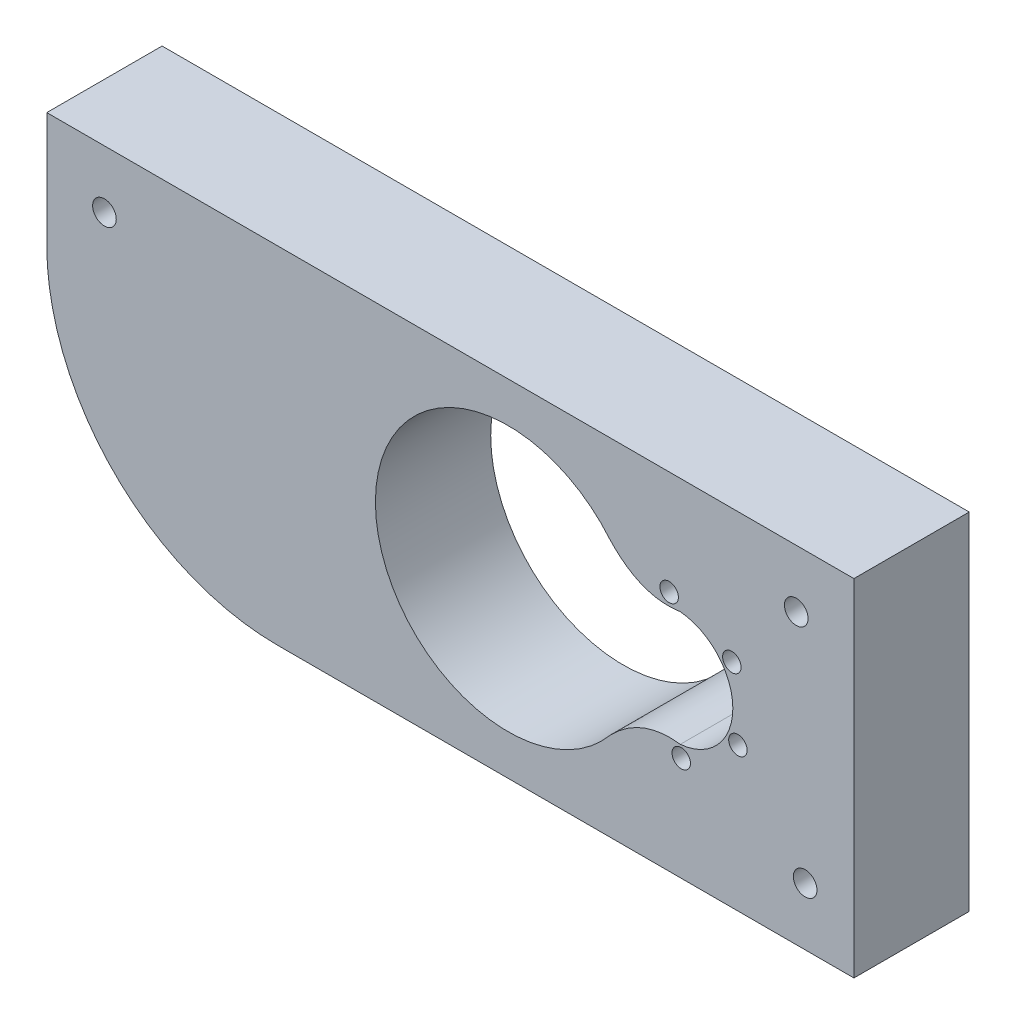
ISO-10303-21;
HEADER;
FILE_DESCRIPTION(('STEP AP214'),'2;1');
FILE_NAME('part.step','',(''),(''),'','','');
FILE_SCHEMA(('AUTOMOTIVE_DESIGN { 1 0 10303 214 1 1 1 1 }'));
ENDSEC;
DATA;
#1=APPLICATION_CONTEXT('core data for automotive mechanical design processes');
#2=APPLICATION_PROTOCOL_DEFINITION('international standard','automotive_design',2000,#1);
#3=PRODUCT_CONTEXT('',#1,'mechanical');
#4=PRODUCT('Part','Part','',(#3));
#5=PRODUCT_RELATED_PRODUCT_CATEGORY('part','',(#4));
#6=PRODUCT_DEFINITION_FORMATION('','',#4);
#7=PRODUCT_DEFINITION_CONTEXT('part definition',#1,'design');
#8=PRODUCT_DEFINITION('design','',#6,#7);
#9=PRODUCT_DEFINITION_SHAPE('','',#8);
#10=(LENGTH_UNIT() NAMED_UNIT(*) SI_UNIT(.MILLI.,.METRE.));
#11=(NAMED_UNIT(*) PLANE_ANGLE_UNIT() SI_UNIT($,.RADIAN.));
#12=(NAMED_UNIT(*) SI_UNIT($,.STERADIAN.) SOLID_ANGLE_UNIT());
#13=UNCERTAINTY_MEASURE_WITH_UNIT(LENGTH_MEASURE(1.E-05),#10,'distance_accuracy_value','');
#14=(GEOMETRIC_REPRESENTATION_CONTEXT(3) GLOBAL_UNCERTAINTY_ASSIGNED_CONTEXT((#13)) GLOBAL_UNIT_ASSIGNED_CONTEXT((#10,
#11,#12)) REPRESENTATION_CONTEXT('',''));
#15=CARTESIAN_POINT('',(0.,0.,0.));
#16=DIRECTION('',(0.,0.,1.));
#17=DIRECTION('',(1.,0.,0.));
#18=AXIS2_PLACEMENT_3D('',#15,#16,#17);
#19=CARTESIAN_POINT('',(0.,0.,10.));
#20=DIRECTION('',(1.,0.,0.));
#21=DIRECTION('',(0.,0.,-1.));
#22=AXIS2_PLACEMENT_3D('',#19,#20,#21);
#23=PLANE('',#22);
#24=DIRECTION('',(0.,-1.,0.));
#25=VECTOR('',#24,1.);
#26=CARTESIAN_POINT('',(0.,0.,0.));
#27=LINE('',#26,#25);
#28=CARTESIAN_POINT('',(0.,30.,0.));
#29=VERTEX_POINT('',#28);
#30=CARTESIAN_POINT('',(0.,20.,0.));
#31=VERTEX_POINT('',#30);
#32=EDGE_CURVE('E190',#29,#31,#27,.T.);
#33=ORIENTED_EDGE('',*,*,#32,.T.);
#34=DIRECTION('',(0.,0.,-1.));
#35=VECTOR('',#34,1.);
#36=CARTESIAN_POINT('',(0.,20.,10.));
#37=LINE('',#36,#35);
#38=CARTESIAN_POINT('',(0.,20.,10.));
#39=VERTEX_POINT('',#38);
#40=EDGE_CURVE('E41',#31,#39,#37,.F.);
#41=ORIENTED_EDGE('',*,*,#40,.T.);
#42=DIRECTION('',(0.,-1.,0.));
#43=VECTOR('',#42,1.);
#44=CARTESIAN_POINT('',(0.,0.,10.));
#45=LINE('',#44,#43);
#46=CARTESIAN_POINT('',(0.,30.,10.));
#47=VERTEX_POINT('',#46);
#48=EDGE_CURVE('E215',#47,#39,#45,.T.);
#49=ORIENTED_EDGE('',*,*,#48,.F.);
#50=DIRECTION('',(0.,0.,-1.));
#51=VECTOR('',#50,1.);
#52=CARTESIAN_POINT('',(0.,30.,10.));
#53=LINE('',#52,#51);
#54=EDGE_CURVE('E192',#47,#29,#53,.T.);
#55=ORIENTED_EDGE('',*,*,#54,.T.);
#56=EDGE_LOOP('',(#33,#41,#49,#55));
#57=FACE_BOUND('',#56,.T.);
#58=ADVANCED_FACE('F33',(#57),#23,.F.);
#59=CARTESIAN_POINT('',(0.,0.,10.));
#60=DIRECTION('',(0.,1.,0.));
#61=DIRECTION('',(0.,0.,1.));
#62=AXIS2_PLACEMENT_3D('',#59,#60,#61);
#63=PLANE('',#62);
#64=DIRECTION('',(1.,0.,0.));
#65=VECTOR('',#64,1.);
#66=CARTESIAN_POINT('',(0.,0.,10.));
#67=LINE('',#66,#65);
#68=CARTESIAN_POINT('',(20.,0.,10.));
#69=VERTEX_POINT('',#68);
#70=CARTESIAN_POINT('',(70.,0.,10.));
#71=VERTEX_POINT('',#70);
#72=EDGE_CURVE('E222',#69,#71,#67,.T.);
#73=ORIENTED_EDGE('',*,*,#72,.F.);
#74=DIRECTION('',(0.,0.,-1.));
#75=VECTOR('',#74,1.);
#76=CARTESIAN_POINT('',(20.,0.,10.));
#77=LINE('',#76,#75);
#78=CARTESIAN_POINT('',(20.,0.,0.));
#79=VERTEX_POINT('',#78);
#80=EDGE_CURVE('E201',#69,#79,#77,.T.);
#81=ORIENTED_EDGE('',*,*,#80,.T.);
#82=DIRECTION('',(1.,0.,0.));
#83=VECTOR('',#82,1.);
#84=CARTESIAN_POINT('',(0.,0.,0.));
#85=LINE('',#84,#83);
#86=CARTESIAN_POINT('',(70.,0.,0.));
#87=VERTEX_POINT('',#86);
#88=EDGE_CURVE('E194',#79,#87,#85,.T.);
#89=ORIENTED_EDGE('',*,*,#88,.T.);
#90=DIRECTION('',(0.,0.,-1.));
#91=VECTOR('',#90,1.);
#92=CARTESIAN_POINT('',(70.,0.,10.));
#93=LINE('',#92,#91);
#94=EDGE_CURVE('E205',#71,#87,#93,.T.);
#95=ORIENTED_EDGE('',*,*,#94,.F.);
#96=EDGE_LOOP('',(#73,#81,#89,#95));
#97=FACE_BOUND('',#96,.T.);
#98=ADVANCED_FACE('F181',(#97),#63,.F.);
#99=CARTESIAN_POINT('',(70.,0.,10.));
#100=DIRECTION('',(-1.,0.,0.));
#101=DIRECTION('',(0.,0.,1.));
#102=AXIS2_PLACEMENT_3D('',#99,#100,#101);
#103=PLANE('',#102);
#104=DIRECTION('',(0.,1.,0.));
#105=VECTOR('',#104,1.);
#106=CARTESIAN_POINT('',(70.,0.,0.));
#107=LINE('',#106,#105);
#108=CARTESIAN_POINT('',(70.,30.,0.));
#109=VERTEX_POINT('',#108);
#110=EDGE_CURVE('E216',#87,#109,#107,.T.);
#111=ORIENTED_EDGE('',*,*,#110,.T.);
#112=DIRECTION('',(0.,0.,-1.));
#113=VECTOR('',#112,1.);
#114=CARTESIAN_POINT('',(70.,30.,10.));
#115=LINE('',#114,#113);
#116=CARTESIAN_POINT('',(70.,30.,10.));
#117=VERTEX_POINT('',#116);
#118=EDGE_CURVE('E208',#117,#109,#115,.T.);
#119=ORIENTED_EDGE('',*,*,#118,.F.);
#120=DIRECTION('',(0.,1.,0.));
#121=VECTOR('',#120,1.);
#122=CARTESIAN_POINT('',(70.,0.,10.));
#123=LINE('',#122,#121);
#124=EDGE_CURVE('E220',#71,#117,#123,.T.);
#125=ORIENTED_EDGE('',*,*,#124,.F.);
#126=ORIENTED_EDGE('',*,*,#94,.T.);
#127=EDGE_LOOP('',(#111,#119,#125,#126));
#128=FACE_BOUND('',#127,.T.);
#129=ADVANCED_FACE('F177',(#128),#103,.F.);
#130=CARTESIAN_POINT('',(0.,30.,10.));
#131=DIRECTION('',(0.,-1.,0.));
#132=DIRECTION('',(0.,0.,-1.));
#133=AXIS2_PLACEMENT_3D('',#130,#131,#132);
#134=PLANE('',#133);
#135=DIRECTION('',(-1.,0.,0.));
#136=VECTOR('',#135,1.);
#137=CARTESIAN_POINT('',(0.,30.,0.));
#138=LINE('',#137,#136);
#139=EDGE_CURVE('E213',#109,#29,#138,.T.);
#140=ORIENTED_EDGE('',*,*,#139,.T.);
#141=ORIENTED_EDGE('',*,*,#54,.F.);
#142=DIRECTION('',(-1.,0.,0.));
#143=VECTOR('',#142,1.);
#144=CARTESIAN_POINT('',(0.,30.,10.));
#145=LINE('',#144,#143);
#146=EDGE_CURVE('E212',#117,#47,#145,.T.);
#147=ORIENTED_EDGE('',*,*,#146,.F.);
#148=ORIENTED_EDGE('',*,*,#118,.T.);
#149=EDGE_LOOP('',(#140,#141,#147,#148));
#150=FACE_BOUND('',#149,.T.);
#151=ADVANCED_FACE('F170',(#150),#134,.F.);
#152=CARTESIAN_POINT('',(0.,0.,10.));
#153=DIRECTION('',(0.,0.,-1.));
#154=DIRECTION('',(-1.,0.,0.));
#155=AXIS2_PLACEMENT_3D('',#152,#153,#154);
#156=PLANE('',#155);
#157=CARTESIAN_POINT('',(65.7711384827735,5.,10.));
#158=DIRECTION('',(0.,0.,1.));
#159=DIRECTION('',(1.,0.,0.));
#160=AXIS2_PLACEMENT_3D('',#157,#158,#159);
#161=CIRCLE('',#160,1.025);
#162=CARTESIAN_POINT('',(66.7961384827735,5.,10.));
#163=VERTEX_POINT('',#162);
#164=EDGE_CURVE('E300',#163,#163,#161,.T.);
#165=ORIENTED_EDGE('',*,*,#164,.F.);
#166=EDGE_LOOP('',(#165));
#167=FACE_BOUND('',#166,.T.);
#168=CARTESIAN_POINT('',(65.,25.,10.));
#169=DIRECTION('',(0.,0.,1.));
#170=DIRECTION('',(1.,0.,0.));
#171=AXIS2_PLACEMENT_3D('',#168,#169,#170);
#172=CIRCLE('',#171,1.025);
#173=CARTESIAN_POINT('',(66.025,25.,10.));
#174=VERTEX_POINT('',#173);
#175=EDGE_CURVE('E305',#174,#174,#172,.T.);
#176=ORIENTED_EDGE('',*,*,#175,.F.);
#177=EDGE_LOOP('',(#176));
#178=FACE_BOUND('',#177,.T.);
#179=CARTESIAN_POINT('',(5.,25.,10.));
#180=DIRECTION('',(0.,0.,1.));
#181=DIRECTION('',(1.,0.,0.));
#182=AXIS2_PLACEMENT_3D('',#179,#180,#181);
#183=CIRCLE('',#182,1.025);
#184=CARTESIAN_POINT('',(6.025,25.,10.));
#185=VERTEX_POINT('',#184);
#186=EDGE_CURVE('E138',#185,#185,#183,.T.);
#187=ORIENTED_EDGE('',*,*,#186,.F.);
#188=EDGE_LOOP('',(#187));
#189=FACE_BOUND('',#188,.T.);
#190=CARTESIAN_POINT('',(55.025445971669,9.02305207226491,10.));
#191=DIRECTION('',(0.,0.,1.));
#192=DIRECTION('',(1.,0.,0.));
#193=AXIS2_PLACEMENT_3D('',#190,#191,#192);
#194=CIRCLE('',#193,0.80000000000001);
#195=CARTESIAN_POINT('',(55.825445971669,9.02305207226491,10.));
#196=VERTEX_POINT('',#195);
#197=EDGE_CURVE('E243',#196,#196,#194,.T.);
#198=ORIENTED_EDGE('',*,*,#197,.F.);
#199=EDGE_LOOP('',(#198));
#200=FACE_BOUND('',#199,.T.);
#201=CARTESIAN_POINT('',(40.,15.,10.));
#202=DIRECTION('',(0.,0.,1.));
#203=DIRECTION('',(1.,0.,0.));
#204=AXIS2_PLACEMENT_3D('',#201,#202,#203);
#205=CIRCLE('',#204,11.5);
#206=CARTESIAN_POINT('',(48.86,22.3314664290304,10.));
#207=VERTEX_POINT('',#206);
#208=CARTESIAN_POINT('',(48.86,7.66853357096958,10.));
#209=VERTEX_POINT('',#208);
#210=EDGE_CURVE('E257',#207,#209,#205,.T.);
#211=ORIENTED_EDGE('',*,*,#210,.F.);
#212=CARTESIAN_POINT('',(54.9408331256196,19.9805287023926,10.));
#213=CARTESIAN_POINT('',(51.5344789961139,19.4593100322375,10.));
#214=CARTESIAN_POINT('',(48.86,22.3314664290304,10.));
#215=B_SPLINE_CURVE_WITH_KNOTS('',2,(#212,#213,#214),.UNSPECIFIED.,.F.,.F.,(3,3),(0.,1.),.UNSPECIFIED.);
#216=CARTESIAN_POINT('',(54.9408331256196,19.9805287023926,10.));
#217=VERTEX_POINT('',#216);
#218=EDGE_CURVE('E111',#217,#207,#215,.T.);
#219=ORIENTED_EDGE('',*,*,#218,.F.);
#220=CARTESIAN_POINT('',(54.5,15.,10.));
#221=DIRECTION('',(0.,0.,1.));
#222=DIRECTION('',(-1.,0.,0.));
#223=AXIS2_PLACEMENT_3D('',#220,#221,#222);
#224=CIRCLE('',#223,5.);
#225=CARTESIAN_POINT('',(54.9408331256196,10.0194712976074,10.));
#226=VERTEX_POINT('',#225);
#227=EDGE_CURVE('E129',#226,#217,#224,.T.);
#228=ORIENTED_EDGE('',*,*,#227,.F.);
#229=CARTESIAN_POINT('',(48.86,7.66853357096957,10.));
#230=CARTESIAN_POINT('',(51.540343022102,10.4460240057026,10.));
#231=CARTESIAN_POINT('',(54.9408331256196,10.0194712976074,10.));
#232=B_SPLINE_CURVE_WITH_KNOTS('',2,(#229,#230,#231),.UNSPECIFIED.,.F.,.F.,(3,3),(0.,1.),.UNSPECIFIED.);
#233=EDGE_CURVE('E132',#209,#226,#232,.T.);
#234=ORIENTED_EDGE('',*,*,#233,.F.);
#235=EDGE_LOOP('',(#211,#219,#228,#234));
#236=FACE_BOUND('',#235,.T.);
#237=CARTESIAN_POINT('',(59.9389117283499,12.466575595914,10.));
#238=DIRECTION('',(0.,0.,1.));
#239=DIRECTION('',(1.,0.,0.));
#240=AXIS2_PLACEMENT_3D('',#237,#238,#239);
#241=CIRCLE('',#240,0.800000000000009);
#242=CARTESIAN_POINT('',(60.7389117283499,12.466575595914,10.));
#243=VERTEX_POINT('',#242);
#244=EDGE_CURVE('E231',#243,#243,#241,.T.);
#245=ORIENTED_EDGE('',*,*,#244,.F.);
#246=EDGE_LOOP('',(#245));
#247=FACE_BOUND('',#246,.T.);
#248=CARTESIAN_POINT('',(59.4134657566808,18.4435235236491,10.));
#249=DIRECTION('',(0.,0.,1.));
#250=DIRECTION('',(1.,0.,0.));
#251=AXIS2_PLACEMENT_3D('',#248,#249,#250);
#252=CIRCLE('',#251,0.800000000000003);
#253=CARTESIAN_POINT('',(60.2134657566808,18.4435235236491,10.));
#254=VERTEX_POINT('',#253);
#255=EDGE_CURVE('E238',#254,#254,#252,.T.);
#256=ORIENTED_EDGE('',*,*,#255,.F.);
#257=EDGE_LOOP('',(#256));
#258=FACE_BOUND('',#257,.T.);
#259=CARTESIAN_POINT('',(53.974554028331,20.9769479277351,10.));
#260=DIRECTION('',(0.,0.,1.));
#261=DIRECTION('',(1.,0.,0.));
#262=AXIS2_PLACEMENT_3D('',#259,#260,#261);
#263=CIRCLE('',#262,0.800000000000016);
#264=CARTESIAN_POINT('',(54.774554028331,20.9769479277351,10.));
#265=VERTEX_POINT('',#264);
#266=EDGE_CURVE('E225',#265,#265,#263,.T.);
#267=ORIENTED_EDGE('',*,*,#266,.F.);
#268=EDGE_LOOP('',(#267));
#269=FACE_BOUND('',#268,.T.);
#270=ORIENTED_EDGE('',*,*,#48,.T.);
#271=CARTESIAN_POINT('',(20.,20.,10.));
#272=DIRECTION('',(0.,0.,-1.));
#273=DIRECTION('',(-1.,0.,0.));
#274=AXIS2_PLACEMENT_3D('',#271,#272,#273);
#275=CIRCLE('',#274,20.);
#276=EDGE_CURVE('E11',#39,#69,#275,.F.);
#277=ORIENTED_EDGE('',*,*,#276,.T.);
#278=ORIENTED_EDGE('',*,*,#72,.T.);
#279=ORIENTED_EDGE('',*,*,#124,.T.);
#280=ORIENTED_EDGE('',*,*,#146,.T.);
#281=EDGE_LOOP('',(#270,#277,#278,#279,#280));
#282=FACE_BOUND('',#281,.T.);
#283=ADVANCED_FACE('F167',(#167,#178,#189,#200,#236,#247,#258,#269,#282),#156,.F.);
#284=CARTESIAN_POINT('',(0.,0.,0.));
#285=DIRECTION('',(0.,0.,-1.));
#286=DIRECTION('',(-1.,0.,0.));
#287=AXIS2_PLACEMENT_3D('',#284,#285,#286);
#288=PLANE('',#287);
#289=CARTESIAN_POINT('',(65.7711384827735,5.,0.));
#290=DIRECTION('',(0.,0.,1.));
#291=DIRECTION('',(1.,0.,0.));
#292=AXIS2_PLACEMENT_3D('',#289,#290,#291);
#293=CIRCLE('',#292,1.025);
#294=CARTESIAN_POINT('',(66.7961384827735,5.,0.));
#295=VERTEX_POINT('',#294);
#296=EDGE_CURVE('E297',#295,#295,#293,.T.);
#297=ORIENTED_EDGE('',*,*,#296,.T.);
#298=EDGE_LOOP('',(#297));
#299=FACE_BOUND('',#298,.T.);
#300=CARTESIAN_POINT('',(65.,25.,0.));
#301=DIRECTION('',(0.,0.,1.));
#302=DIRECTION('',(1.,0.,0.));
#303=AXIS2_PLACEMENT_3D('',#300,#301,#302);
#304=CIRCLE('',#303,1.025);
#305=CARTESIAN_POINT('',(66.025,25.,0.));
#306=VERTEX_POINT('',#305);
#307=EDGE_CURVE('E301',#306,#306,#304,.T.);
#308=ORIENTED_EDGE('',*,*,#307,.T.);
#309=EDGE_LOOP('',(#308));
#310=FACE_BOUND('',#309,.T.);
#311=CARTESIAN_POINT('',(5.,25.,0.));
#312=DIRECTION('',(0.,0.,1.));
#313=DIRECTION('',(1.,0.,0.));
#314=AXIS2_PLACEMENT_3D('',#311,#312,#313);
#315=CIRCLE('',#314,1.025);
#316=CARTESIAN_POINT('',(6.025,25.,0.));
#317=VERTEX_POINT('',#316);
#318=EDGE_CURVE('E265',#317,#317,#315,.T.);
#319=ORIENTED_EDGE('',*,*,#318,.T.);
#320=EDGE_LOOP('',(#319));
#321=FACE_BOUND('',#320,.T.);
#322=CARTESIAN_POINT('',(55.025445971669,9.02305207226491,0.));
#323=DIRECTION('',(0.,0.,1.));
#324=DIRECTION('',(1.,0.,0.));
#325=AXIS2_PLACEMENT_3D('',#322,#323,#324);
#326=CIRCLE('',#325,0.80000000000001);
#327=CARTESIAN_POINT('',(55.825445971669,9.02305207226491,0.));
#328=VERTEX_POINT('',#327);
#329=EDGE_CURVE('E235',#328,#328,#326,.T.);
#330=ORIENTED_EDGE('',*,*,#329,.T.);
#331=EDGE_LOOP('',(#330));
#332=FACE_BOUND('',#331,.T.);
#333=CARTESIAN_POINT('',(54.9408331256196,19.9805287023926,0.));
#334=CARTESIAN_POINT('',(51.5344789961139,19.4593100322375,0.));
#335=CARTESIAN_POINT('',(48.86,22.3314664290304,0.));
#336=B_SPLINE_CURVE_WITH_KNOTS('',2,(#333,#334,#335),.UNSPECIFIED.,.F.,.F.,(3,3),(0.,1.),.UNSPECIFIED.);
#337=CARTESIAN_POINT('',(54.9408331256196,19.9805287023926,0.));
#338=VERTEX_POINT('',#337);
#339=CARTESIAN_POINT('',(48.86,22.3314664290304,0.));
#340=VERTEX_POINT('',#339);
#341=EDGE_CURVE('E108',#338,#340,#336,.T.);
#342=ORIENTED_EDGE('',*,*,#341,.T.);
#343=CARTESIAN_POINT('',(40.,15.,0.));
#344=DIRECTION('',(0.,0.,1.));
#345=DIRECTION('',(1.,0.,0.));
#346=AXIS2_PLACEMENT_3D('',#343,#344,#345);
#347=CIRCLE('',#346,11.5);
#348=CARTESIAN_POINT('',(48.86,7.66853357096958,0.));
#349=VERTEX_POINT('',#348);
#350=EDGE_CURVE('E120',#340,#349,#347,.T.);
#351=ORIENTED_EDGE('',*,*,#350,.T.);
#352=CARTESIAN_POINT('',(48.86,7.66853357096957,0.));
#353=CARTESIAN_POINT('',(51.540343022102,10.4460240057026,0.));
#354=CARTESIAN_POINT('',(54.9408331256196,10.0194712976074,0.));
#355=B_SPLINE_CURVE_WITH_KNOTS('',2,(#352,#353,#354),.UNSPECIFIED.,.F.,.F.,(3,3),(0.,1.),.UNSPECIFIED.);
#356=CARTESIAN_POINT('',(54.9408331256196,10.0194712976074,0.));
#357=VERTEX_POINT('',#356);
#358=EDGE_CURVE('E124',#349,#357,#355,.T.);
#359=ORIENTED_EDGE('',*,*,#358,.T.);
#360=CARTESIAN_POINT('',(54.5,15.,0.));
#361=DIRECTION('',(0.,0.,1.));
#362=DIRECTION('',(-1.,0.,0.));
#363=AXIS2_PLACEMENT_3D('',#360,#361,#362);
#364=CIRCLE('',#363,5.);
#365=EDGE_CURVE('E116',#357,#338,#364,.T.);
#366=ORIENTED_EDGE('',*,*,#365,.T.);
#367=EDGE_LOOP('',(#342,#351,#359,#366));
#368=FACE_BOUND('',#367,.T.);
#369=CARTESIAN_POINT('',(59.9389117283499,12.466575595914,0.));
#370=DIRECTION('',(0.,0.,1.));
#371=DIRECTION('',(1.,0.,0.));
#372=AXIS2_PLACEMENT_3D('',#369,#370,#371);
#373=CIRCLE('',#372,0.800000000000009);
#374=CARTESIAN_POINT('',(60.7389117283499,12.466575595914,0.));
#375=VERTEX_POINT('',#374);
#376=EDGE_CURVE('E234',#375,#375,#373,.T.);
#377=ORIENTED_EDGE('',*,*,#376,.T.);
#378=EDGE_LOOP('',(#377));
#379=FACE_BOUND('',#378,.T.);
#380=CARTESIAN_POINT('',(59.4134657566808,18.4435235236491,0.));
#381=DIRECTION('',(0.,0.,1.));
#382=DIRECTION('',(1.,0.,0.));
#383=AXIS2_PLACEMENT_3D('',#380,#381,#382);
#384=CIRCLE('',#383,0.800000000000003);
#385=CARTESIAN_POINT('',(60.2134657566808,18.4435235236491,0.));
#386=VERTEX_POINT('',#385);
#387=EDGE_CURVE('E228',#386,#386,#384,.T.);
#388=ORIENTED_EDGE('',*,*,#387,.T.);
#389=EDGE_LOOP('',(#388));
#390=FACE_BOUND('',#389,.T.);
#391=CARTESIAN_POINT('',(53.974554028331,20.9769479277351,0.));
#392=DIRECTION('',(0.,0.,1.));
#393=DIRECTION('',(1.,0.,0.));
#394=AXIS2_PLACEMENT_3D('',#391,#392,#393);
#395=CIRCLE('',#394,0.800000000000016);
#396=CARTESIAN_POINT('',(54.774554028331,20.9769479277351,0.));
#397=VERTEX_POINT('',#396);
#398=EDGE_CURVE('E195',#397,#397,#395,.T.);
#399=ORIENTED_EDGE('',*,*,#398,.T.);
#400=EDGE_LOOP('',(#399));
#401=FACE_BOUND('',#400,.T.);
#402=ORIENTED_EDGE('',*,*,#88,.F.);
#403=CARTESIAN_POINT('',(20.,20.,0.));
#404=DIRECTION('',(0.,0.,-1.));
#405=DIRECTION('',(-1.,0.,0.));
#406=AXIS2_PLACEMENT_3D('',#403,#404,#405);
#407=CIRCLE('',#406,20.);
#408=EDGE_CURVE('E55',#79,#31,#407,.T.);
#409=ORIENTED_EDGE('',*,*,#408,.T.);
#410=ORIENTED_EDGE('',*,*,#32,.F.);
#411=ORIENTED_EDGE('',*,*,#139,.F.);
#412=ORIENTED_EDGE('',*,*,#110,.F.);
#413=EDGE_LOOP('',(#402,#409,#410,#411,#412));
#414=FACE_BOUND('',#413,.T.);
#415=ADVANCED_FACE('F126',(#299,#310,#321,#332,#368,#379,#390,#401,#414),#288,.T.);
#416=CARTESIAN_POINT('',(53.974554028331,20.9769479277351,0.));
#417=DIRECTION('',(0.,0.,1.));
#418=DIRECTION('',(1.,0.,0.));
#419=AXIS2_PLACEMENT_3D('',#416,#417,#418);
#420=CYLINDRICAL_SURFACE('',#419,0.800000000000016);
#421=ORIENTED_EDGE('',*,*,#398,.F.);
#422=EDGE_LOOP('',(#421));
#423=FACE_BOUND('',#422,.T.);
#424=ORIENTED_EDGE('',*,*,#266,.T.);
#425=EDGE_LOOP('',(#424));
#426=FACE_BOUND('',#425,.T.);
#427=ADVANCED_FACE('F159',(#423,#426),#420,.F.);
#428=CARTESIAN_POINT('',(59.4134657566808,18.4435235236491,0.));
#429=DIRECTION('',(0.,0.,1.));
#430=DIRECTION('',(1.,0.,0.));
#431=AXIS2_PLACEMENT_3D('',#428,#429,#430);
#432=CYLINDRICAL_SURFACE('',#431,0.800000000000003);
#433=ORIENTED_EDGE('',*,*,#387,.F.);
#434=EDGE_LOOP('',(#433));
#435=FACE_BOUND('',#434,.T.);
#436=ORIENTED_EDGE('',*,*,#255,.T.);
#437=EDGE_LOOP('',(#436));
#438=FACE_BOUND('',#437,.T.);
#439=ADVANCED_FACE('F156',(#435,#438),#432,.F.);
#440=CARTESIAN_POINT('',(59.9389117283499,12.466575595914,0.));
#441=DIRECTION('',(0.,0.,1.));
#442=DIRECTION('',(1.,0.,0.));
#443=AXIS2_PLACEMENT_3D('',#440,#441,#442);
#444=CYLINDRICAL_SURFACE('',#443,0.800000000000009);
#445=ORIENTED_EDGE('',*,*,#376,.F.);
#446=EDGE_LOOP('',(#445));
#447=FACE_BOUND('',#446,.T.);
#448=ORIENTED_EDGE('',*,*,#244,.T.);
#449=EDGE_LOOP('',(#448));
#450=FACE_BOUND('',#449,.T.);
#451=ADVANCED_FACE('F149',(#447,#450),#444,.F.);
#452=DIRECTION('',(0.,0.,1.));
#453=VECTOR('',#452,1.);
#454=SURFACE_OF_LINEAR_EXTRUSION('',#336,#453);
#455=ORIENTED_EDGE('',*,*,#218,.T.);
#456=DIRECTION('',(0.,0.,1.));
#457=VECTOR('',#456,1.);
#458=CARTESIAN_POINT('',(48.86,22.3314664290304,0.));
#459=LINE('',#458,#457);
#460=EDGE_CURVE('E104',#340,#207,#459,.T.);
#461=ORIENTED_EDGE('',*,*,#460,.F.);
#462=ORIENTED_EDGE('',*,*,#341,.F.);
#463=DIRECTION('',(0.,0.,1.));
#464=VECTOR('',#463,1.);
#465=CARTESIAN_POINT('',(54.9408331256196,19.9805287023926,0.));
#466=LINE('',#465,#464);
#467=EDGE_CURVE('E246',#338,#217,#466,.T.);
#468=ORIENTED_EDGE('',*,*,#467,.T.);
#469=EDGE_LOOP('',(#455,#461,#462,#468));
#470=FACE_BOUND('',#469,.T.);
#471=ADVANCED_FACE('F106',(#470),#454,.F.);
#472=CARTESIAN_POINT('',(54.5,15.,0.));
#473=DIRECTION('',(0.,0.,1.));
#474=DIRECTION('',(1.,0.,0.));
#475=AXIS2_PLACEMENT_3D('',#472,#473,#474);
#476=CYLINDRICAL_SURFACE('',#475,5.);
#477=ORIENTED_EDGE('',*,*,#227,.T.);
#478=ORIENTED_EDGE('',*,*,#467,.F.);
#479=ORIENTED_EDGE('',*,*,#365,.F.);
#480=DIRECTION('',(0.,0.,1.));
#481=VECTOR('',#480,1.);
#482=CARTESIAN_POINT('',(54.9408331256196,10.0194712976074,0.));
#483=LINE('',#482,#481);
#484=EDGE_CURVE('E250',#357,#226,#483,.T.);
#485=ORIENTED_EDGE('',*,*,#484,.T.);
#486=EDGE_LOOP('',(#477,#478,#479,#485));
#487=FACE_BOUND('',#486,.T.);
#488=ADVANCED_FACE('F148',(#487),#476,.F.);
#489=DIRECTION('',(0.,0.,1.));
#490=VECTOR('',#489,1.);
#491=SURFACE_OF_LINEAR_EXTRUSION('',#355,#490);
#492=ORIENTED_EDGE('',*,*,#233,.T.);
#493=ORIENTED_EDGE('',*,*,#484,.F.);
#494=ORIENTED_EDGE('',*,*,#358,.F.);
#495=DIRECTION('',(0.,0.,1.));
#496=VECTOR('',#495,1.);
#497=CARTESIAN_POINT('',(48.86,7.66853357096958,0.));
#498=LINE('',#497,#496);
#499=EDGE_CURVE('E115',#349,#209,#498,.T.);
#500=ORIENTED_EDGE('',*,*,#499,.T.);
#501=EDGE_LOOP('',(#492,#493,#494,#500));
#502=FACE_BOUND('',#501,.T.);
#503=ADVANCED_FACE('F275',(#502),#491,.F.);
#504=CARTESIAN_POINT('',(40.,15.,0.));
#505=DIRECTION('',(0.,0.,1.));
#506=DIRECTION('',(1.,0.,0.));
#507=AXIS2_PLACEMENT_3D('',#504,#505,#506);
#508=CYLINDRICAL_SURFACE('',#507,11.5);
#509=ORIENTED_EDGE('',*,*,#210,.T.);
#510=ORIENTED_EDGE('',*,*,#499,.F.);
#511=ORIENTED_EDGE('',*,*,#350,.F.);
#512=ORIENTED_EDGE('',*,*,#460,.T.);
#513=EDGE_LOOP('',(#509,#510,#511,#512));
#514=FACE_BOUND('',#513,.T.);
#515=ADVANCED_FACE('F121',(#514),#508,.F.);
#516=CARTESIAN_POINT('',(55.025445971669,9.02305207226491,0.));
#517=DIRECTION('',(0.,0.,1.));
#518=DIRECTION('',(1.,0.,0.));
#519=AXIS2_PLACEMENT_3D('',#516,#517,#518);
#520=CYLINDRICAL_SURFACE('',#519,0.80000000000001);
#521=ORIENTED_EDGE('',*,*,#329,.F.);
#522=EDGE_LOOP('',(#521));
#523=FACE_BOUND('',#522,.T.);
#524=ORIENTED_EDGE('',*,*,#197,.T.);
#525=EDGE_LOOP('',(#524));
#526=FACE_BOUND('',#525,.T.);
#527=ADVANCED_FACE('F151',(#523,#526),#520,.F.);
#528=CARTESIAN_POINT('',(5.,25.,0.));
#529=DIRECTION('',(0.,0.,1.));
#530=DIRECTION('',(1.,0.,0.));
#531=AXIS2_PLACEMENT_3D('',#528,#529,#530);
#532=CYLINDRICAL_SURFACE('',#531,1.025);
#533=ORIENTED_EDGE('',*,*,#318,.F.);
#534=EDGE_LOOP('',(#533));
#535=FACE_BOUND('',#534,.T.);
#536=ORIENTED_EDGE('',*,*,#186,.T.);
#537=EDGE_LOOP('',(#536));
#538=FACE_BOUND('',#537,.T.);
#539=ADVANCED_FACE('F154',(#535,#538),#532,.F.);
#540=CARTESIAN_POINT('',(65.,25.,0.));
#541=DIRECTION('',(0.,0.,1.));
#542=DIRECTION('',(1.,0.,0.));
#543=AXIS2_PLACEMENT_3D('',#540,#541,#542);
#544=CYLINDRICAL_SURFACE('',#543,1.025);
#545=ORIENTED_EDGE('',*,*,#307,.F.);
#546=EDGE_LOOP('',(#545));
#547=FACE_BOUND('',#546,.T.);
#548=ORIENTED_EDGE('',*,*,#175,.T.);
#549=EDGE_LOOP('',(#548));
#550=FACE_BOUND('',#549,.T.);
#551=ADVANCED_FACE('F284',(#547,#550),#544,.F.);
#552=CARTESIAN_POINT('',(65.7711384827735,5.,0.));
#553=DIRECTION('',(0.,0.,1.));
#554=DIRECTION('',(1.,0.,0.));
#555=AXIS2_PLACEMENT_3D('',#552,#553,#554);
#556=CYLINDRICAL_SURFACE('',#555,1.025);
#557=ORIENTED_EDGE('',*,*,#296,.F.);
#558=EDGE_LOOP('',(#557));
#559=FACE_BOUND('',#558,.T.);
#560=ORIENTED_EDGE('',*,*,#164,.T.);
#561=EDGE_LOOP('',(#560));
#562=FACE_BOUND('',#561,.T.);
#563=ADVANCED_FACE('F288',(#559,#562),#556,.F.);
#564=CARTESIAN_POINT('',(20.,20.,10.));
#565=DIRECTION('',(0.,0.,-1.));
#566=DIRECTION('',(-1.,0.,0.));
#567=AXIS2_PLACEMENT_3D('',#564,#565,#566);
#568=CYLINDRICAL_SURFACE('',#567,20.);
#569=ORIENTED_EDGE('',*,*,#276,.F.);
#570=ORIENTED_EDGE('',*,*,#40,.F.);
#571=ORIENTED_EDGE('',*,*,#408,.F.);
#572=ORIENTED_EDGE('',*,*,#80,.F.);
#573=EDGE_LOOP('',(#569,#570,#571,#572));
#574=FACE_BOUND('',#573,.T.);
#575=ADVANCED_FACE('F35',(#574),#568,.T.);
#576=CLOSED_SHELL('',(#58,#98,#129,#151,#283,#415,#427,#439,#451,#471,#488,#503,#515,#527,#539,
#551,#563,#575));
#577=MANIFOLD_SOLID_BREP('B2',#576);
#578=ADVANCED_BREP_SHAPE_REPRESENTATION('',(#18,#577),#14);
#579=SHAPE_DEFINITION_REPRESENTATION(#9,#578);
ENDSEC;
END-ISO-10303-21;
